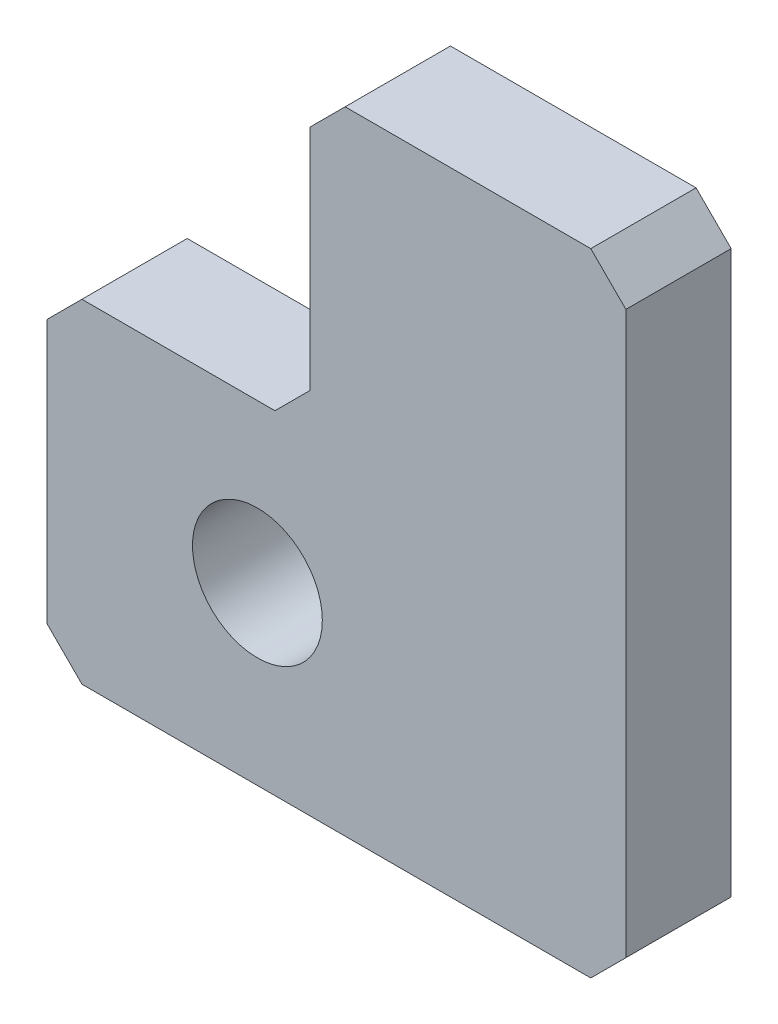
ISO-10303-21;
HEADER;
FILE_DESCRIPTION(('STEP AP214'),'2;1');
FILE_NAME('part.step','',(''),(''),'','','');
FILE_SCHEMA(('AUTOMOTIVE_DESIGN { 1 0 10303 214 1 1 1 1 }'));
ENDSEC;
DATA;
#1=APPLICATION_CONTEXT('core data for automotive mechanical design processes');
#2=APPLICATION_PROTOCOL_DEFINITION('international standard','automotive_design',2000,#1);
#3=PRODUCT_CONTEXT('',#1,'mechanical');
#4=PRODUCT('Part','Part','',(#3));
#5=PRODUCT_RELATED_PRODUCT_CATEGORY('part','',(#4));
#6=PRODUCT_DEFINITION_FORMATION('','',#4);
#7=PRODUCT_DEFINITION_CONTEXT('part definition',#1,'design');
#8=PRODUCT_DEFINITION('design','',#6,#7);
#9=PRODUCT_DEFINITION_SHAPE('','',#8);
#10=(LENGTH_UNIT() NAMED_UNIT(*) SI_UNIT(.MILLI.,.METRE.));
#11=(NAMED_UNIT(*) PLANE_ANGLE_UNIT() SI_UNIT($,.RADIAN.));
#12=(NAMED_UNIT(*) SI_UNIT($,.STERADIAN.) SOLID_ANGLE_UNIT());
#13=UNCERTAINTY_MEASURE_WITH_UNIT(LENGTH_MEASURE(1.E-05),#10,'distance_accuracy_value','');
#14=(GEOMETRIC_REPRESENTATION_CONTEXT(3) GLOBAL_UNCERTAINTY_ASSIGNED_CONTEXT((#13)) GLOBAL_UNIT_ASSIGNED_CONTEXT((#10,
#11,#12)) REPRESENTATION_CONTEXT('',''));
#15=CARTESIAN_POINT('',(0.,0.,0.));
#16=DIRECTION('',(0.,0.,1.));
#17=DIRECTION('',(1.,0.,0.));
#18=AXIS2_PLACEMENT_3D('',#15,#16,#17);
#19=CARTESIAN_POINT('',(-166.520340409626,14.6846032090013,-2.99999999999833));
#20=DIRECTION('',(0.,0.780868809443031,-0.624695047554424));
#21=DIRECTION('',(0.,0.624695047554424,0.780868809443031));
#22=AXIS2_PLACEMENT_3D('',#19,#20,#21);
#23=PLANE('',#22);
#24=CARTESIAN_POINT('',(-172.520340409626,13.1344195992209,-4.93772951222384));
#25=DIRECTION('',(0.,0.780868809443031,-0.624695047554424));
#26=DIRECTION('',(0.,0.624695047554424,0.780868809443031));
#27=AXIS2_PLACEMENT_3D('',#24,#25,#26);
#28=ELLIPSE('',#27,2.9614449598127,1.85);
#29=CARTESIAN_POINT('',(-171.510671763006,14.6846032090013,-2.99999999999833));
#30=VERTEX_POINT('',#29);
#31=CARTESIAN_POINT('',(-170.687310131644,12.8844195992209,-5.25022951222383));
#32=VERTEX_POINT('',#31);
#33=EDGE_CURVE('E153',#30,#32,#28,.T.);
#34=ORIENTED_EDGE('',*,*,#33,.F.);
#35=DIRECTION('',(-1.,0.,0.));
#36=VECTOR('',#35,1.);
#37=CARTESIAN_POINT('',(-166.520340409626,14.6846032090013,-2.99999999999833));
#38=LINE('',#37,#36);
#39=CARTESIAN_POINT('',(-166.520340409626,14.6846032090013,-2.99999999999833));
#40=VERTEX_POINT('',#39);
#41=EDGE_CURVE('E163',#40,#30,#38,.T.);
#42=ORIENTED_EDGE('',*,*,#41,.F.);
#43=DIRECTION('',(0.,-0.624695047554424,-0.780868809443031));
#44=VECTOR('',#43,1.);
#45=CARTESIAN_POINT('',(-166.520340409626,14.6846032090013,-2.99999999999833));
#46=LINE('',#45,#44);
#47=CARTESIAN_POINT('',(-166.520340409626,12.8844195992209,-5.25022951222383));
#48=VERTEX_POINT('',#47);
#49=EDGE_CURVE('E276',#40,#48,#46,.T.);
#50=ORIENTED_EDGE('',*,*,#49,.T.);
#51=DIRECTION('',(-1.,0.,0.));
#52=VECTOR('',#51,1.);
#53=CARTESIAN_POINT('',(-166.520340409626,12.8844195992209,-5.25022951222383));
#54=LINE('',#53,#52);
#55=EDGE_CURVE('E165',#48,#32,#54,.T.);
#56=ORIENTED_EDGE('',*,*,#55,.T.);
#57=EDGE_LOOP('',(#34,#42,#50,#56));
#58=FACE_BOUND('',#57,.T.);
#59=ADVANCED_FACE('F32',(#58),#23,.T.);
#60=CARTESIAN_POINT('',(-166.520340409626,17.6344195992209,-2.99999999999833));
#61=DIRECTION('',(0.,-1.,0.));
#62=DIRECTION('',(1.,0.,0.));
#63=AXIS2_PLACEMENT_3D('',#60,#61,#62);
#64=PLANE('',#63);
#65=DIRECTION('',(-1.,0.,0.));
#66=VECTOR('',#65,1.);
#67=CARTESIAN_POINT('',(-166.520340409626,17.6344195992209,1.67378461437092E-12));
#68=LINE('',#67,#66);
#69=CARTESIAN_POINT('',(-172.020340409626,17.6344195992209,1.67364831466923E-12));
#70=VERTEX_POINT('',#69);
#71=CARTESIAN_POINT('',(-177.520340409626,17.6344195992209,1.67351201496755E-12));
#72=VERTEX_POINT('',#71);
#73=EDGE_CURVE('E180',#70,#72,#68,.T.);
#74=ORIENTED_EDGE('',*,*,#73,.F.);
#75=DIRECTION('',(0.,0.,-1.));
#76=VECTOR('',#75,1.);
#77=CARTESIAN_POINT('',(-172.020340409626,17.6344195992209,-2.99999999999832));
#78=LINE('',#77,#76);
#79=CARTESIAN_POINT('',(-172.020340409626,17.6344195992209,-2.99999999999833));
#80=VERTEX_POINT('',#79);
#81=EDGE_CURVE('E199',#70,#80,#78,.T.);
#82=ORIENTED_EDGE('',*,*,#81,.T.);
#83=DIRECTION('',(-1.,0.,0.));
#84=VECTOR('',#83,1.);
#85=CARTESIAN_POINT('',(-166.520340409626,17.6344195992209,-2.99999999999833));
#86=LINE('',#85,#84);
#87=CARTESIAN_POINT('',(-177.520340409626,17.6344195992209,-2.99999999999833));
#88=VERTEX_POINT('',#87);
#89=EDGE_CURVE('E175',#80,#88,#86,.T.);
#90=ORIENTED_EDGE('',*,*,#89,.T.);
#91=DIRECTION('',(0.,0.,1.));
#92=VECTOR('',#91,1.);
#93=CARTESIAN_POINT('',(-177.520340409626,17.6344195992209,1.67348723320361E-12));
#94=LINE('',#93,#92);
#95=EDGE_CURVE('E196',#88,#72,#94,.T.);
#96=ORIENTED_EDGE('',*,*,#95,.T.);
#97=EDGE_LOOP('',(#74,#82,#90,#96));
#98=FACE_BOUND('',#97,.T.);
#99=ADVANCED_FACE('F250',(#98),#64,.F.);
#100=CARTESIAN_POINT('',(-166.520340409626,0.,0.));
#101=DIRECTION('',(-1.,0.,0.));
#102=DIRECTION('',(0.,0.,1.));
#103=AXIS2_PLACEMENT_3D('',#100,#101,#102);
#104=PLANE('',#103);
#105=DIRECTION('',(0.,1.,0.));
#106=VECTOR('',#105,1.);
#107=CARTESIAN_POINT('',(-166.520340409626,0.,-2.99999999999833));
#108=LINE('',#107,#106);
#109=CARTESIAN_POINT('',(-166.520340409626,11.0842359894405,-2.99999999999833));
#110=VERTEX_POINT('',#109);
#111=EDGE_CURVE('E170',#110,#40,#108,.T.);
#112=ORIENTED_EDGE('',*,*,#111,.F.);
#113=DIRECTION('',(0.,-0.624695047554424,0.780868809443031));
#114=VECTOR('',#113,1.);
#115=CARTESIAN_POINT('',(-166.520340409626,12.8844195992209,-5.25022951222383));
#116=LINE('',#115,#114);
#117=EDGE_CURVE('E188',#48,#110,#116,.T.);
#118=ORIENTED_EDGE('',*,*,#117,.F.);
#119=ORIENTED_EDGE('',*,*,#49,.F.);
#120=EDGE_LOOP('',(#112,#118,#119));
#121=FACE_BOUND('',#120,.T.);
#122=ADVANCED_FACE('F337',(#121),#104,.F.);
#123=CARTESIAN_POINT('',(-166.520340409626,12.8844195992209,-5.25022951222383));
#124=DIRECTION('',(0.,-0.780868809443031,-0.624695047554424));
#125=DIRECTION('',(0.,0.624695047554424,-0.780868809443031));
#126=AXIS2_PLACEMENT_3D('',#123,#124,#125);
#127=PLANE('',#126);
#128=CARTESIAN_POINT('',(-172.520340409626,13.1344195992209,-5.56272951222383));
#129=DIRECTION('',(0.,-0.780868809443031,-0.624695047554424));
#130=DIRECTION('',(0.,-0.624695047554424,0.780868809443031));
#131=AXIS2_PLACEMENT_3D('',#128,#129,#130);
#132=ELLIPSE('',#131,2.9614449598127,1.85);
#133=CARTESIAN_POINT('',(-174.353370687608,12.8844195992209,-5.25022951222383));
#134=VERTEX_POINT('',#133);
#135=EDGE_CURVE('E166',#32,#134,#132,.T.);
#136=ORIENTED_EDGE('',*,*,#135,.F.);
#137=ORIENTED_EDGE('',*,*,#55,.F.);
#138=ORIENTED_EDGE('',*,*,#117,.T.);
#139=DIRECTION('',(-1.,0.,0.));
#140=VECTOR('',#139,1.);
#141=CARTESIAN_POINT('',(-166.520340409626,11.0842359894405,-2.99999999999833));
#142=LINE('',#141,#140);
#143=CARTESIAN_POINT('',(-178.520340409626,11.0842359894405,-2.99999999999833));
#144=VERTEX_POINT('',#143);
#145=EDGE_CURVE('E191',#110,#144,#142,.T.);
#146=ORIENTED_EDGE('',*,*,#145,.T.);
#147=DIRECTION('',(0.,-0.624695047554424,0.780868809443031));
#148=VECTOR('',#147,1.);
#149=CARTESIAN_POINT('',(-178.520340409626,12.8844195992209,-5.25022951222383));
#150=LINE('',#149,#148);
#151=CARTESIAN_POINT('',(-178.520340409626,12.8844195992209,-5.25022951222383));
#152=VERTEX_POINT('',#151);
#153=EDGE_CURVE('E278',#152,#144,#150,.T.);
#154=ORIENTED_EDGE('',*,*,#153,.F.);
#155=EDGE_CURVE('E171',#134,#152,#54,.T.);
#156=ORIENTED_EDGE('',*,*,#155,.F.);
#157=EDGE_LOOP('',(#136,#137,#138,#146,#154,#156));
#158=FACE_BOUND('',#157,.T.);
#159=ADVANCED_FACE('F294',(#158),#127,.T.);
#160=CARTESIAN_POINT('',(-173.530009056246,14.6846032090013,-2.99999999999833));
#161=VERTEX_POINT('',#160);
#162=EDGE_CURVE('E47',#134,#161,#28,.T.);
#163=ORIENTED_EDGE('',*,*,#162,.F.);
#164=ORIENTED_EDGE('',*,*,#155,.T.);
#165=DIRECTION('',(0.,-0.624695047554424,-0.780868809443031));
#166=VECTOR('',#165,1.);
#167=CARTESIAN_POINT('',(-178.520340409626,14.6846032090013,-2.99999999999833));
#168=LINE('',#167,#166);
#169=CARTESIAN_POINT('',(-178.520340409626,14.6846032090013,-2.99999999999833));
#170=VERTEX_POINT('',#169);
#171=EDGE_CURVE('E288',#170,#152,#168,.T.);
#172=ORIENTED_EDGE('',*,*,#171,.F.);
#173=EDGE_CURVE('E172',#161,#170,#38,.T.);
#174=ORIENTED_EDGE('',*,*,#173,.F.);
#175=EDGE_LOOP('',(#163,#164,#172,#174));
#176=FACE_BOUND('',#175,.T.);
#177=ADVANCED_FACE('F303',(#176),#23,.T.);
#178=CARTESIAN_POINT('',(-166.520340409626,17.6344195992209,-2.99999999999833));
#179=DIRECTION('',(0.,0.,-1.));
#180=DIRECTION('',(0.,1.,0.));
#181=AXIS2_PLACEMENT_3D('',#178,#179,#180);
#182=PLANE('',#181);
#183=CARTESIAN_POINT('',(-172.520340409626,13.1344195992209,-2.99999999999833));
#184=DIRECTION('',(0.,0.,-1.));
#185=DIRECTION('',(0.,1.,0.));
#186=AXIS2_PLACEMENT_3D('',#183,#184,#185);
#187=CIRCLE('',#186,1.85);
#188=EDGE_CURVE('E149',#161,#30,#187,.T.);
#189=ORIENTED_EDGE('',*,*,#188,.F.);
#190=ORIENTED_EDGE('',*,*,#173,.T.);
#191=DIRECTION('',(0.,-1.,0.));
#192=VECTOR('',#191,1.);
#193=CARTESIAN_POINT('',(-178.520340409626,17.6344195992209,-2.99999999999833));
#194=LINE('',#193,#192);
#195=CARTESIAN_POINT('',(-178.520340409626,16.6344195992209,-2.99999999999833));
#196=VERTEX_POINT('',#195);
#197=EDGE_CURVE('E285',#196,#170,#194,.T.);
#198=ORIENTED_EDGE('',*,*,#197,.F.);
#199=DIRECTION('',(0.707106781186552,0.707106781186543,0.));
#200=VECTOR('',#199,1.);
#201=CARTESIAN_POINT('',(-172.020340409626,23.1344195992209,-2.99999999999832));
#202=LINE('',#201,#200);
#203=EDGE_CURVE('E216',#196,#88,#202,.T.);
#204=ORIENTED_EDGE('',*,*,#203,.T.);
#205=ORIENTED_EDGE('',*,*,#89,.F.);
#206=DIRECTION('',(-0.707106781186548,-0.707106781186548,0.));
#207=VECTOR('',#206,1.);
#208=CARTESIAN_POINT('',(-171.020340409626,18.6344195992209,-2.99999999999833));
#209=LINE('',#208,#207);
#210=CARTESIAN_POINT('',(-171.020340409626,18.6344195992209,-2.99999999999832));
#211=VERTEX_POINT('',#210);
#212=EDGE_CURVE('E11',#80,#211,#209,.F.);
#213=ORIENTED_EDGE('',*,*,#212,.T.);
#214=DIRECTION('',(0.,1.,0.));
#215=VECTOR('',#214,1.);
#216=CARTESIAN_POINT('',(-171.020340409626,26.1344195992209,-2.99999999999832));
#217=LINE('',#216,#215);
#218=CARTESIAN_POINT('',(-171.020340409626,25.1344195992209,-2.99999999999832));
#219=VERTEX_POINT('',#218);
#220=EDGE_CURVE('E257',#211,#219,#217,.T.);
#221=ORIENTED_EDGE('',*,*,#220,.T.);
#222=DIRECTION('',(-0.70710678118655,-0.707106781186545,0.));
#223=VECTOR('',#222,1.);
#224=CARTESIAN_POINT('',(-172.520340409626,23.6344195992209,-2.99999999999832));
#225=LINE('',#224,#223);
#226=CARTESIAN_POINT('',(-170.020340409626,26.1344195992209,-2.99999999999832));
#227=VERTEX_POINT('',#226);
#228=EDGE_CURVE('E223',#219,#227,#225,.F.);
#229=ORIENTED_EDGE('',*,*,#228,.T.);
#230=DIRECTION('',(-1.,0.,0.));
#231=VECTOR('',#230,1.);
#232=CARTESIAN_POINT('',(-162.020340409626,26.1344195992209,-2.99999999999832));
#233=LINE('',#232,#231);
#234=CARTESIAN_POINT('',(-163.020340409626,26.1344195992209,-2.99999999999832));
#235=VERTEX_POINT('',#234);
#236=EDGE_CURVE('E272',#235,#227,#233,.T.);
#237=ORIENTED_EDGE('',*,*,#236,.F.);
#238=DIRECTION('',(0.707106781186545,-0.70710678118655,0.));
#239=VECTOR('',#238,1.);
#240=CARTESIAN_POINT('',(-160.520340409626,23.6344195992209,-2.99999999999832));
#241=LINE('',#240,#239);
#242=CARTESIAN_POINT('',(-162.020340409626,25.1344195992209,-2.99999999999832));
#243=VERTEX_POINT('',#242);
#244=EDGE_CURVE('E221',#235,#243,#241,.T.);
#245=ORIENTED_EDGE('',*,*,#244,.T.);
#246=DIRECTION('',(0.,1.,0.));
#247=VECTOR('',#246,1.);
#248=CARTESIAN_POINT('',(-162.020340409626,26.1344195992209,-2.99999999999832));
#249=LINE('',#248,#247);
#250=CARTESIAN_POINT('',(-162.020340409626,9.13441959922089,-2.99999999999833));
#251=VERTEX_POINT('',#250);
#252=EDGE_CURVE('E265',#251,#243,#249,.T.);
#253=ORIENTED_EDGE('',*,*,#252,.F.);
#254=DIRECTION('',(0.707106781186545,0.70710678118655,0.));
#255=VECTOR('',#254,1.);
#256=CARTESIAN_POINT('',(-160.020340409626,11.1344195992209,-2.99999999999833));
#257=LINE('',#256,#255);
#258=CARTESIAN_POINT('',(-163.020340409626,8.13441959922088,-2.99999999999833));
#259=VERTEX_POINT('',#258);
#260=EDGE_CURVE('E219',#251,#259,#257,.F.);
#261=ORIENTED_EDGE('',*,*,#260,.T.);
#262=DIRECTION('',(-1.,0.,0.));
#263=VECTOR('',#262,1.);
#264=CARTESIAN_POINT('',(-166.520340409626,8.13441959922089,-2.99999999999833));
#265=LINE('',#264,#263);
#266=CARTESIAN_POINT('',(-177.520340409626,8.13441959922089,-2.99999999999833));
#267=VERTEX_POINT('',#266);
#268=EDGE_CURVE('E186',#259,#267,#265,.T.);
#269=ORIENTED_EDGE('',*,*,#268,.T.);
#270=DIRECTION('',(0.707106781186546,-0.707106781186549,0.));
#271=VECTOR('',#270,1.);
#272=CARTESIAN_POINT('',(-176.770340409626,7.3844195992209,-2.99999999999833));
#273=LINE('',#272,#271);
#274=CARTESIAN_POINT('',(-178.520340409626,9.1344195992209,-2.99999999999833));
#275=VERTEX_POINT('',#274);
#276=EDGE_CURVE('E55',#267,#275,#273,.F.);
#277=ORIENTED_EDGE('',*,*,#276,.T.);
#278=DIRECTION('',(0.,-1.,0.));
#279=VECTOR('',#278,1.);
#280=CARTESIAN_POINT('',(-178.520340409626,11.0842359894405,-2.99999999999833));
#281=LINE('',#280,#279);
#282=EDGE_CURVE('E275',#144,#275,#281,.T.);
#283=ORIENTED_EDGE('',*,*,#282,.F.);
#284=ORIENTED_EDGE('',*,*,#145,.F.);
#285=ORIENTED_EDGE('',*,*,#111,.T.);
#286=ORIENTED_EDGE('',*,*,#41,.T.);
#287=EDGE_LOOP('',(#189,#190,#198,#204,#205,#213,#221,#229,#237,#245,#253,#261,#269,#277,#283,
#284,#285,#286));
#288=FACE_BOUND('',#287,.T.);
#289=ADVANCED_FACE('F168',(#288),#182,.T.);
#290=CARTESIAN_POINT('',(-166.520340409626,17.6344195992209,1.67378461437092E-12));
#291=DIRECTION('',(0.,0.,-1.));
#292=DIRECTION('',(-1.,0.,0.));
#293=AXIS2_PLACEMENT_3D('',#290,#291,#292);
#294=PLANE('',#293);
#295=CARTESIAN_POINT('',(-172.520340409626,13.1344195992209,0.));
#296=DIRECTION('',(0.,0.,1.));
#297=DIRECTION('',(1.,0.,0.));
#298=AXIS2_PLACEMENT_3D('',#295,#296,#297);
#299=CIRCLE('',#298,1.85);
#300=CARTESIAN_POINT('',(-170.670340409626,13.1344195992209,0.));
#301=VERTEX_POINT('',#300);
#302=EDGE_CURVE('E157',#301,#301,#299,.T.);
#303=ORIENTED_EDGE('',*,*,#302,.F.);
#304=EDGE_LOOP('',(#303));
#305=FACE_BOUND('',#304,.T.);
#306=DIRECTION('',(-1.,0.,0.));
#307=VECTOR('',#306,1.);
#308=CARTESIAN_POINT('',(-162.020340409626,26.1344195992209,1.67593469166373E-12));
#309=LINE('',#308,#307);
#310=CARTESIAN_POINT('',(-163.020340409626,26.1344195992209,1.67593469166373E-12));
#311=VERTEX_POINT('',#310);
#312=CARTESIAN_POINT('',(-170.020340409626,26.1344195992209,1.67593469166373E-12));
#313=VERTEX_POINT('',#312);
#314=EDGE_CURVE('E270',#311,#313,#309,.T.);
#315=ORIENTED_EDGE('',*,*,#314,.T.);
#316=DIRECTION('',(0.70710678118655,0.707106781186545,0.));
#317=VECTOR('',#316,1.);
#318=CARTESIAN_POINT('',(-170.020340409626,26.1344195992209,1.67369787819712E-12));
#319=LINE('',#318,#317);
#320=CARTESIAN_POINT('',(-171.020340409626,25.1344195992209,1.67581222698381E-12));
#321=VERTEX_POINT('',#320);
#322=EDGE_CURVE('E214',#313,#321,#319,.F.);
#323=ORIENTED_EDGE('',*,*,#322,.T.);
#324=DIRECTION('',(0.,-1.,0.));
#325=VECTOR('',#324,1.);
#326=CARTESIAN_POINT('',(-171.020340409626,26.1344195992209,1.67593469166373E-12));
#327=LINE('',#326,#325);
#328=CARTESIAN_POINT('',(-171.020340409626,18.6344195992209,1.67501620656436E-12));
#329=VERTEX_POINT('',#328);
#330=EDGE_CURVE('E245',#321,#329,#327,.T.);
#331=ORIENTED_EDGE('',*,*,#330,.T.);
#332=DIRECTION('',(0.707106781186548,0.707106781186548,0.));
#333=VECTOR('',#332,1.);
#334=CARTESIAN_POINT('',(-169.270340409626,20.3844195992209,1.67371646452008E-12));
#335=LINE('',#334,#333);
#336=EDGE_CURVE('E40',#329,#70,#335,.F.);
#337=ORIENTED_EDGE('',*,*,#336,.T.);
#338=ORIENTED_EDGE('',*,*,#73,.T.);
#339=DIRECTION('',(-0.707106781186552,-0.707106781186543,0.));
#340=VECTOR('',#339,1.);
#341=CARTESIAN_POINT('',(-177.520340409626,17.6344195992209,1.67314079257963E-12));
#342=LINE('',#341,#340);
#343=CARTESIAN_POINT('',(-178.520340409626,16.6344195992209,1.67348723320361E-12));
#344=VERTEX_POINT('',#343);
#345=EDGE_CURVE('E206',#72,#344,#342,.T.);
#346=ORIENTED_EDGE('',*,*,#345,.T.);
#347=DIRECTION('',(0.,-1.,0.));
#348=VECTOR('',#347,1.);
#349=CARTESIAN_POINT('',(-178.520340409626,17.6344195992209,1.67348723320361E-12));
#350=LINE('',#349,#348);
#351=CARTESIAN_POINT('',(-178.520340409626,9.13441959922089,1.67348723320361E-12));
#352=VERTEX_POINT('',#351);
#353=EDGE_CURVE('E282',#344,#352,#350,.T.);
#354=ORIENTED_EDGE('',*,*,#353,.T.);
#355=DIRECTION('',(-0.707106781186546,0.707106781186549,0.));
#356=VECTOR('',#355,1.);
#357=CARTESIAN_POINT('',(-178.520340409626,9.13441959922089,1.67348723320361E-12));
#358=LINE('',#357,#356);
#359=CARTESIAN_POINT('',(-177.520340409626,8.13441959922089,1.67351201496755E-12));
#360=VERTEX_POINT('',#359);
#361=EDGE_CURVE('E208',#352,#360,#358,.F.);
#362=ORIENTED_EDGE('',*,*,#361,.T.);
#363=DIRECTION('',(-1.,0.,0.));
#364=VECTOR('',#363,1.);
#365=CARTESIAN_POINT('',(-166.520340409626,8.13441959922088,1.67378461437092E-12));
#366=LINE('',#365,#364);
#367=CARTESIAN_POINT('',(-163.020340409626,8.13441959922088,1.67387135054472E-12));
#368=VERTEX_POINT('',#367);
#369=EDGE_CURVE('E183',#368,#360,#366,.T.);
#370=ORIENTED_EDGE('',*,*,#369,.F.);
#371=DIRECTION('',(-0.707106781186545,-0.70710678118655,0.));
#372=VECTOR('',#371,1.);
#373=CARTESIAN_POINT('',(-162.020340409626,9.13441959922089,1.67389613230866E-12));
#374=LINE('',#373,#372);
#375=CARTESIAN_POINT('',(-162.020340409626,9.13441959922089,1.67385279210518E-12));
#376=VERTEX_POINT('',#375);
#377=EDGE_CURVE('E210',#368,#376,#374,.F.);
#378=ORIENTED_EDGE('',*,*,#377,.T.);
#379=DIRECTION('',(0.,-1.,0.));
#380=VECTOR('',#379,1.);
#381=CARTESIAN_POINT('',(-162.020340409626,26.1344195992209,1.67593469166373E-12));
#382=LINE('',#381,#380);
#383=CARTESIAN_POINT('',(-162.020340409626,25.1344195992209,1.67581222698381E-12));
#384=VERTEX_POINT('',#383);
#385=EDGE_CURVE('E262',#384,#376,#382,.T.);
#386=ORIENTED_EDGE('',*,*,#385,.F.);
#387=DIRECTION('',(-0.707106781186545,0.70710678118655,0.));
#388=VECTOR('',#387,1.);
#389=CARTESIAN_POINT('',(-162.020340409626,25.1344195992209,1.67389613230866E-12));
#390=LINE('',#389,#388);
#391=EDGE_CURVE('E212',#384,#311,#390,.T.);
#392=ORIENTED_EDGE('',*,*,#391,.T.);
#393=EDGE_LOOP('',(#315,#323,#331,#337,#338,#346,#354,#362,#370,#378,#386,#392));
#394=FACE_BOUND('',#393,.T.);
#395=ADVANCED_FACE('F243',(#305,#394),#294,.F.);
#396=CARTESIAN_POINT('',(-166.520340409626,8.13441959922089,-2.99999999999833));
#397=DIRECTION('',(0.,-1.,0.));
#398=DIRECTION('',(0.,0.,-1.));
#399=AXIS2_PLACEMENT_3D('',#396,#397,#398);
#400=PLANE('',#399);
#401=ORIENTED_EDGE('',*,*,#268,.F.);
#402=DIRECTION('',(0.,0.,1.));
#403=VECTOR('',#402,1.);
#404=CARTESIAN_POINT('',(-163.020340409626,8.13441959922088,-2.99999999999833));
#405=LINE('',#404,#403);
#406=EDGE_CURVE('E233',#259,#368,#405,.T.);
#407=ORIENTED_EDGE('',*,*,#406,.T.);
#408=ORIENTED_EDGE('',*,*,#369,.T.);
#409=DIRECTION('',(0.,0.,-1.));
#410=VECTOR('',#409,1.);
#411=CARTESIAN_POINT('',(-177.520340409626,8.13441959922089,-2.99999999999833));
#412=LINE('',#411,#410);
#413=EDGE_CURVE('E231',#360,#267,#412,.T.);
#414=ORIENTED_EDGE('',*,*,#413,.T.);
#415=EDGE_LOOP('',(#401,#407,#408,#414));
#416=FACE_BOUND('',#415,.T.);
#417=ADVANCED_FACE('F353',(#416),#400,.T.);
#418=CARTESIAN_POINT('',(-178.520340409626,0.,0.));
#419=DIRECTION('',(-1.,0.,0.));
#420=DIRECTION('',(0.,0.,1.));
#421=AXIS2_PLACEMENT_3D('',#418,#419,#420);
#422=PLANE('',#421);
#423=ORIENTED_EDGE('',*,*,#282,.T.);
#424=DIRECTION('',(0.,0.,1.));
#425=VECTOR('',#424,1.);
#426=CARTESIAN_POINT('',(-178.520340409626,9.13441959922089,0.));
#427=LINE('',#426,#425);
#428=EDGE_CURVE('E237',#275,#352,#427,.T.);
#429=ORIENTED_EDGE('',*,*,#428,.T.);
#430=ORIENTED_EDGE('',*,*,#353,.F.);
#431=DIRECTION('',(0.,0.,-1.));
#432=VECTOR('',#431,1.);
#433=CARTESIAN_POINT('',(-178.520340409626,16.6344195992209,-2.99999999999833));
#434=LINE('',#433,#432);
#435=EDGE_CURVE('E235',#344,#196,#434,.T.);
#436=ORIENTED_EDGE('',*,*,#435,.T.);
#437=ORIENTED_EDGE('',*,*,#197,.T.);
#438=ORIENTED_EDGE('',*,*,#171,.T.);
#439=ORIENTED_EDGE('',*,*,#153,.T.);
#440=EDGE_LOOP('',(#423,#429,#430,#436,#437,#438,#439));
#441=FACE_BOUND('',#440,.T.);
#442=ADVANCED_FACE('F299',(#441),#422,.T.);
#443=CARTESIAN_POINT('',(-171.020340409626,0.,0.));
#444=DIRECTION('',(1.,0.,0.));
#445=DIRECTION('',(0.,0.,-1.));
#446=AXIS2_PLACEMENT_3D('',#443,#444,#445);
#447=PLANE('',#446);
#448=ORIENTED_EDGE('',*,*,#220,.F.);
#449=DIRECTION('',(0.,0.,1.));
#450=VECTOR('',#449,1.);
#451=CARTESIAN_POINT('',(-171.020340409626,18.6344195992209,1.67489374188445E-12));
#452=LINE('',#451,#450);
#453=EDGE_CURVE('E193',#211,#329,#452,.T.);
#454=ORIENTED_EDGE('',*,*,#453,.T.);
#455=ORIENTED_EDGE('',*,*,#330,.F.);
#456=DIRECTION('',(0.,0.,-1.));
#457=VECTOR('',#456,1.);
#458=CARTESIAN_POINT('',(-171.020340409626,25.1344195992209,0.));
#459=LINE('',#458,#457);
#460=EDGE_CURVE('E190',#321,#219,#459,.T.);
#461=ORIENTED_EDGE('',*,*,#460,.T.);
#462=EDGE_LOOP('',(#448,#454,#455,#461));
#463=FACE_BOUND('',#462,.T.);
#464=ADVANCED_FACE('F260',(#463),#447,.F.);
#465=CARTESIAN_POINT('',(-162.020340409626,26.1344195992209,1.67593469166373E-12));
#466=DIRECTION('',(0.,-1.,0.));
#467=DIRECTION('',(0.,0.,-1.));
#468=AXIS2_PLACEMENT_3D('',#465,#466,#467);
#469=PLANE('',#468);
#470=ORIENTED_EDGE('',*,*,#236,.T.);
#471=DIRECTION('',(0.,0.,1.));
#472=VECTOR('',#471,1.);
#473=CARTESIAN_POINT('',(-170.020340409626,26.1344195992209,1.67593469166373E-12));
#474=LINE('',#473,#472);
#475=EDGE_CURVE('E203',#227,#313,#474,.T.);
#476=ORIENTED_EDGE('',*,*,#475,.T.);
#477=ORIENTED_EDGE('',*,*,#314,.F.);
#478=DIRECTION('',(0.,0.,-1.));
#479=VECTOR('',#478,1.);
#480=CARTESIAN_POINT('',(-163.020340409626,26.1344195992209,-2.99999999999832));
#481=LINE('',#480,#479);
#482=EDGE_CURVE('E201',#311,#235,#481,.T.);
#483=ORIENTED_EDGE('',*,*,#482,.T.);
#484=EDGE_LOOP('',(#470,#476,#477,#483));
#485=FACE_BOUND('',#484,.T.);
#486=ADVANCED_FACE('F318',(#485),#469,.F.);
#487=CARTESIAN_POINT('',(-162.020340409626,0.,0.));
#488=DIRECTION('',(1.,0.,0.));
#489=DIRECTION('',(0.,0.,-1.));
#490=AXIS2_PLACEMENT_3D('',#487,#488,#489);
#491=PLANE('',#490);
#492=ORIENTED_EDGE('',*,*,#252,.T.);
#493=DIRECTION('',(0.,0.,1.));
#494=VECTOR('',#493,1.);
#495=CARTESIAN_POINT('',(-162.020340409626,25.1344195992209,1.67477820934641E-12));
#496=LINE('',#495,#494);
#497=EDGE_CURVE('E228',#243,#384,#496,.T.);
#498=ORIENTED_EDGE('',*,*,#497,.T.);
#499=ORIENTED_EDGE('',*,*,#385,.T.);
#500=DIRECTION('',(0.,0.,-1.));
#501=VECTOR('',#500,1.);
#502=CARTESIAN_POINT('',(-162.020340409626,9.13441959922089,0.));
#503=LINE('',#502,#501);
#504=EDGE_CURVE('E225',#376,#251,#503,.T.);
#505=ORIENTED_EDGE('',*,*,#504,.T.);
#506=EDGE_LOOP('',(#492,#498,#499,#505));
#507=FACE_BOUND('',#506,.T.);
#508=ADVANCED_FACE('F309',(#507),#491,.T.);
#509=CARTESIAN_POINT('',(-171.020340409626,18.6344195992209,0.));
#510=DIRECTION('',(-0.707106781186547,0.707106781186547,0.));
#511=DIRECTION('',(0.,0.,-1.));
#512=AXIS2_PLACEMENT_3D('',#509,#510,#511);
#513=PLANE('',#512);
#514=ORIENTED_EDGE('',*,*,#212,.F.);
#515=ORIENTED_EDGE('',*,*,#81,.F.);
#516=ORIENTED_EDGE('',*,*,#336,.F.);
#517=ORIENTED_EDGE('',*,*,#453,.F.);
#518=EDGE_LOOP('',(#514,#515,#516,#517));
#519=FACE_BOUND('',#518,.T.);
#520=ADVANCED_FACE('F254',(#519),#513,.T.);
#521=CARTESIAN_POINT('',(-170.020340409626,26.1344195992209,1.67593469166373E-12));
#522=DIRECTION('',(0.707106781186545,-0.70710678118655,0.));
#523=DIRECTION('',(0.,0.,1.));
#524=AXIS2_PLACEMENT_3D('',#521,#522,#523);
#525=PLANE('',#524);
#526=ORIENTED_EDGE('',*,*,#228,.F.);
#527=ORIENTED_EDGE('',*,*,#460,.F.);
#528=ORIENTED_EDGE('',*,*,#322,.F.);
#529=ORIENTED_EDGE('',*,*,#475,.F.);
#530=EDGE_LOOP('',(#526,#527,#528,#529));
#531=FACE_BOUND('',#530,.T.);
#532=ADVANCED_FACE('F322',(#531),#525,.F.);
#533=CARTESIAN_POINT('',(-162.020340409626,25.1344195992209,0.));
#534=DIRECTION('',(0.70710678118655,0.707106781186545,0.));
#535=DIRECTION('',(0.,0.,-1.));
#536=AXIS2_PLACEMENT_3D('',#533,#534,#535);
#537=PLANE('',#536);
#538=ORIENTED_EDGE('',*,*,#244,.F.);
#539=ORIENTED_EDGE('',*,*,#482,.F.);
#540=ORIENTED_EDGE('',*,*,#391,.F.);
#541=ORIENTED_EDGE('',*,*,#497,.F.);
#542=EDGE_LOOP('',(#538,#539,#540,#541));
#543=FACE_BOUND('',#542,.T.);
#544=ADVANCED_FACE('F314',(#543),#537,.T.);
#545=CARTESIAN_POINT('',(-162.020340409626,9.13441959922089,0.));
#546=DIRECTION('',(-0.70710678118655,0.707106781186545,0.));
#547=DIRECTION('',(0.,0.,-1.));
#548=AXIS2_PLACEMENT_3D('',#545,#546,#547);
#549=PLANE('',#548);
#550=ORIENTED_EDGE('',*,*,#377,.F.);
#551=ORIENTED_EDGE('',*,*,#406,.F.);
#552=ORIENTED_EDGE('',*,*,#260,.F.);
#553=ORIENTED_EDGE('',*,*,#504,.F.);
#554=EDGE_LOOP('',(#550,#551,#552,#553));
#555=FACE_BOUND('',#554,.T.);
#556=ADVANCED_FACE('F329',(#555),#549,.F.);
#557=CARTESIAN_POINT('',(-178.520340409626,9.13441959922089,0.));
#558=DIRECTION('',(0.707106781186549,0.707106781186546,0.));
#559=DIRECTION('',(0.,0.,1.));
#560=AXIS2_PLACEMENT_3D('',#557,#558,#559);
#561=PLANE('',#560);
#562=ORIENTED_EDGE('',*,*,#276,.F.);
#563=ORIENTED_EDGE('',*,*,#413,.F.);
#564=ORIENTED_EDGE('',*,*,#361,.F.);
#565=ORIENTED_EDGE('',*,*,#428,.F.);
#566=EDGE_LOOP('',(#562,#563,#564,#565));
#567=FACE_BOUND('',#566,.T.);
#568=ADVANCED_FACE('F365',(#567),#561,.F.);
#569=CARTESIAN_POINT('',(-177.520340409626,17.6344195992209,-2.99999999999833));
#570=DIRECTION('',(-0.707106781186543,0.707106781186552,0.));
#571=DIRECTION('',(0.,0.,-1.));
#572=AXIS2_PLACEMENT_3D('',#569,#570,#571);
#573=PLANE('',#572);
#574=ORIENTED_EDGE('',*,*,#203,.F.);
#575=ORIENTED_EDGE('',*,*,#435,.F.);
#576=ORIENTED_EDGE('',*,*,#345,.F.);
#577=ORIENTED_EDGE('',*,*,#95,.F.);
#578=EDGE_LOOP('',(#574,#575,#576,#577));
#579=FACE_BOUND('',#578,.T.);
#580=ADVANCED_FACE('F34',(#579),#573,.T.);
#581=CARTESIAN_POINT('',(-172.520340409626,13.1344195992209,-12.));
#582=DIRECTION('',(0.,0.,1.));
#583=DIRECTION('',(1.,0.,0.));
#584=AXIS2_PLACEMENT_3D('',#581,#582,#583);
#585=CYLINDRICAL_SURFACE('',#584,1.85);
#586=ORIENTED_EDGE('',*,*,#135,.T.);
#587=ORIENTED_EDGE('',*,*,#162,.T.);
#588=ORIENTED_EDGE('',*,*,#188,.T.);
#589=ORIENTED_EDGE('',*,*,#33,.T.);
#590=EDGE_LOOP('',(#586,#587,#588,#589));
#591=FACE_BOUND('',#590,.T.);
#592=ORIENTED_EDGE('',*,*,#302,.T.);
#593=EDGE_LOOP('',(#592));
#594=FACE_BOUND('',#593,.T.);
#595=ADVANCED_FACE('F151',(#591,#594),#585,.F.);
#596=CLOSED_SHELL('',(#59,#99,#122,#159,#177,#289,#395,#417,#442,#464,#486,#508,#520,#532,#544,
#556,#568,#580,#595));
#597=MANIFOLD_SOLID_BREP('B2',#596);
#598=ADVANCED_BREP_SHAPE_REPRESENTATION('',(#18,#597),#14);
#599=SHAPE_DEFINITION_REPRESENTATION(#9,#598);
ENDSEC;
END-ISO-10303-21;
